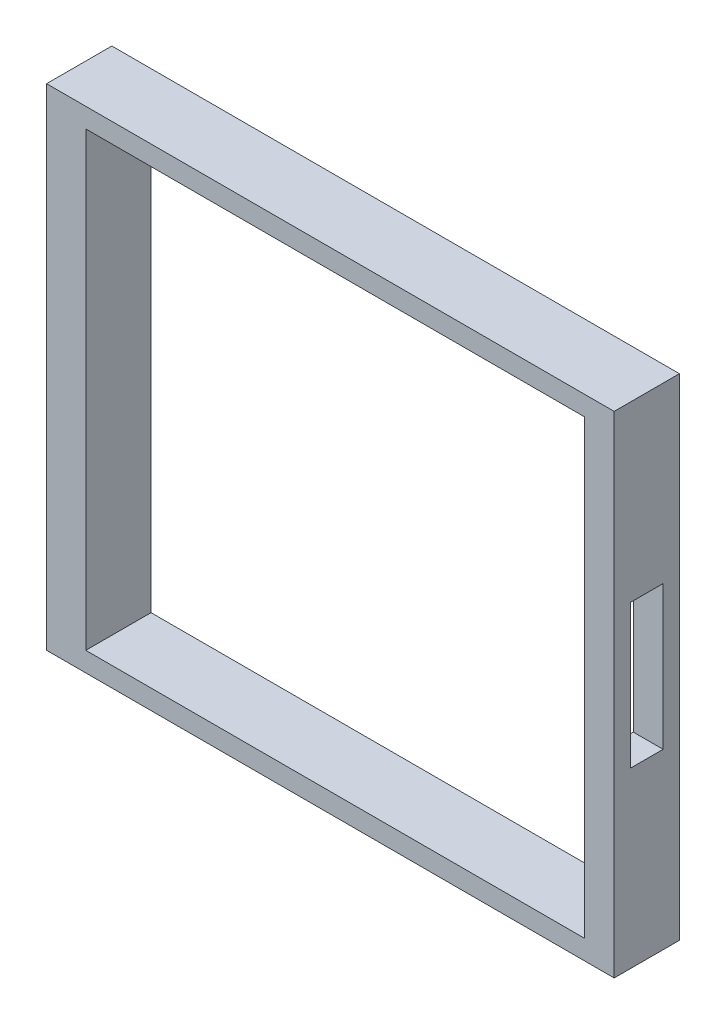
ISO-10303-21;
HEADER;
FILE_DESCRIPTION(('STEP AP214'),'2;1');
FILE_NAME('part.step','',(''),(''),'','','');
FILE_SCHEMA(('AUTOMOTIVE_DESIGN { 1 0 10303 214 1 1 1 1 }'));
ENDSEC;
DATA;
#1=APPLICATION_CONTEXT('core data for automotive mechanical design processes');
#2=APPLICATION_PROTOCOL_DEFINITION('international standard','automotive_design',2000,#1);
#3=PRODUCT_CONTEXT('',#1,'mechanical');
#4=PRODUCT('Part','Part','',(#3));
#5=PRODUCT_RELATED_PRODUCT_CATEGORY('part','',(#4));
#6=PRODUCT_DEFINITION_FORMATION('','',#4);
#7=PRODUCT_DEFINITION_CONTEXT('part definition',#1,'design');
#8=PRODUCT_DEFINITION('design','',#6,#7);
#9=PRODUCT_DEFINITION_SHAPE('','',#8);
#10=(LENGTH_UNIT() NAMED_UNIT(*) SI_UNIT(.MILLI.,.METRE.));
#11=(NAMED_UNIT(*) PLANE_ANGLE_UNIT() SI_UNIT($,.RADIAN.));
#12=(NAMED_UNIT(*) SI_UNIT($,.STERADIAN.) SOLID_ANGLE_UNIT());
#13=UNCERTAINTY_MEASURE_WITH_UNIT(LENGTH_MEASURE(1.E-05),#10,'distance_accuracy_value','');
#14=(GEOMETRIC_REPRESENTATION_CONTEXT(3) GLOBAL_UNCERTAINTY_ASSIGNED_CONTEXT((#13)) GLOBAL_UNIT_ASSIGNED_CONTEXT((#10,
#11,#12)) REPRESENTATION_CONTEXT('',''));
#15=CARTESIAN_POINT('',(0.,0.,0.));
#16=DIRECTION('',(0.,0.,1.));
#17=DIRECTION('',(1.,0.,0.));
#18=AXIS2_PLACEMENT_3D('',#15,#16,#17);
#19=CARTESIAN_POINT('',(0.,0.,10.));
#20=DIRECTION('',(0.,0.,1.));
#21=DIRECTION('',(1.,0.,0.));
#22=AXIS2_PLACEMENT_3D('',#19,#20,#21);
#23=PLANE('',#22);
#24=DIRECTION('',(0.,-1.,0.));
#25=VECTOR('',#24,1.);
#26=CARTESIAN_POINT('',(-40.5786086910142,22.956628741391,10.));
#27=LINE('',#26,#25);
#28=CARTESIAN_POINT('',(-40.5786086910142,22.956628741391,10.));
#29=VERTEX_POINT('',#28);
#30=CARTESIAN_POINT('',(-40.5786086910142,-52.243371258609,10.));
#31=VERTEX_POINT('',#30);
#32=EDGE_CURVE('E214',#29,#31,#27,.T.);
#33=ORIENTED_EDGE('',*,*,#32,.T.);
#34=DIRECTION('',(1.,0.,0.));
#35=VECTOR('',#34,1.);
#36=CARTESIAN_POINT('',(-40.5786086910142,-52.243371258609,10.));
#37=LINE('',#36,#35);
#38=CARTESIAN_POINT('',(46.3987708933674,-52.243371258609,10.));
#39=VERTEX_POINT('',#38);
#40=EDGE_CURVE('E218',#31,#39,#37,.T.);
#41=ORIENTED_EDGE('',*,*,#40,.T.);
#42=DIRECTION('',(0.,1.,0.));
#43=VECTOR('',#42,1.);
#44=CARTESIAN_POINT('',(46.3987708933674,22.956628741391,10.));
#45=LINE('',#44,#43);
#46=CARTESIAN_POINT('',(46.3987708933674,22.956628741391,10.));
#47=VERTEX_POINT('',#46);
#48=EDGE_CURVE('E222',#39,#47,#45,.T.);
#49=ORIENTED_EDGE('',*,*,#48,.T.);
#50=DIRECTION('',(-1.,0.,0.));
#51=VECTOR('',#50,1.);
#52=CARTESIAN_POINT('',(-40.5786086910142,22.956628741391,10.));
#53=LINE('',#52,#51);
#54=EDGE_CURVE('E225',#47,#29,#53,.T.);
#55=ORIENTED_EDGE('',*,*,#54,.T.);
#56=EDGE_LOOP('',(#33,#41,#49,#55));
#57=FACE_BOUND('',#56,.T.);
#58=DIRECTION('',(1.,0.,0.));
#59=VECTOR('',#58,1.);
#60=CARTESIAN_POINT('',(-34.5728365384615,-49.243371258609,10.));
#61=LINE('',#60,#59);
#62=CARTESIAN_POINT('',(-34.5728365384615,-49.243371258609,10.));
#63=VERTEX_POINT('',#62);
#64=CARTESIAN_POINT('',(41.8271634615385,-49.243371258609,10.));
#65=VERTEX_POINT('',#64);
#66=EDGE_CURVE('E174',#63,#65,#61,.T.);
#67=ORIENTED_EDGE('',*,*,#66,.F.);
#68=DIRECTION('',(0.,-1.,0.));
#69=VECTOR('',#68,1.);
#70=CARTESIAN_POINT('',(-34.5728365384615,19.956628741391,10.));
#71=LINE('',#70,#69);
#72=CARTESIAN_POINT('',(-34.5728365384615,19.956628741391,10.));
#73=VERTEX_POINT('',#72);
#74=EDGE_CURVE('E171',#73,#63,#71,.T.);
#75=ORIENTED_EDGE('',*,*,#74,.F.);
#76=DIRECTION('',(-1.,0.,0.));
#77=VECTOR('',#76,1.);
#78=CARTESIAN_POINT('',(-34.5728365384615,19.956628741391,10.));
#79=LINE('',#78,#77);
#80=CARTESIAN_POINT('',(41.8271634615385,19.956628741391,10.));
#81=VERTEX_POINT('',#80);
#82=EDGE_CURVE('E182',#81,#73,#79,.T.);
#83=ORIENTED_EDGE('',*,*,#82,.F.);
#84=DIRECTION('',(0.,1.,0.));
#85=VECTOR('',#84,1.);
#86=CARTESIAN_POINT('',(41.8271634615385,19.956628741391,10.));
#87=LINE('',#86,#85);
#88=EDGE_CURVE('E178',#65,#81,#87,.T.);
#89=ORIENTED_EDGE('',*,*,#88,.F.);
#90=EDGE_LOOP('',(#67,#75,#83,#89));
#91=FACE_BOUND('',#90,.T.);
#92=ADVANCED_FACE('F46',(#57,#91),#23,.T.);
#93=CARTESIAN_POINT('',(0.,0.,0.));
#94=DIRECTION('',(0.,0.,1.));
#95=DIRECTION('',(1.,0.,0.));
#96=AXIS2_PLACEMENT_3D('',#93,#94,#95);
#97=PLANE('',#96);
#98=DIRECTION('',(0.,-1.,0.));
#99=VECTOR('',#98,1.);
#100=CARTESIAN_POINT('',(-40.5786086910142,22.956628741391,0.));
#101=LINE('',#100,#99);
#102=CARTESIAN_POINT('',(-40.5786086910142,22.956628741391,0.));
#103=VERTEX_POINT('',#102);
#104=CARTESIAN_POINT('',(-40.5786086910142,-52.243371258609,0.));
#105=VERTEX_POINT('',#104);
#106=EDGE_CURVE('E213',#103,#105,#101,.T.);
#107=ORIENTED_EDGE('',*,*,#106,.F.);
#108=DIRECTION('',(-1.,0.,0.));
#109=VECTOR('',#108,1.);
#110=CARTESIAN_POINT('',(-40.5786086910142,22.956628741391,0.));
#111=LINE('',#110,#109);
#112=CARTESIAN_POINT('',(46.3987708933674,22.956628741391,0.));
#113=VERTEX_POINT('',#112);
#114=EDGE_CURVE('E219',#113,#103,#111,.T.);
#115=ORIENTED_EDGE('',*,*,#114,.F.);
#116=DIRECTION('',(0.,1.,0.));
#117=VECTOR('',#116,1.);
#118=CARTESIAN_POINT('',(46.3987708933674,22.956628741391,0.));
#119=LINE('',#118,#117);
#120=CARTESIAN_POINT('',(46.3987708933674,-52.243371258609,0.));
#121=VERTEX_POINT('',#120);
#122=EDGE_CURVE('E235',#121,#113,#119,.T.);
#123=ORIENTED_EDGE('',*,*,#122,.F.);
#124=DIRECTION('',(1.,0.,0.));
#125=VECTOR('',#124,1.);
#126=CARTESIAN_POINT('',(-40.5786086910142,-52.243371258609,0.));
#127=LINE('',#126,#125);
#128=EDGE_CURVE('E232',#105,#121,#127,.T.);
#129=ORIENTED_EDGE('',*,*,#128,.F.);
#130=EDGE_LOOP('',(#107,#115,#123,#129));
#131=FACE_BOUND('',#130,.T.);
#132=DIRECTION('',(0.,-1.,0.));
#133=VECTOR('',#132,1.);
#134=CARTESIAN_POINT('',(-34.5728365384615,19.956628741391,0.));
#135=LINE('',#134,#133);
#136=CARTESIAN_POINT('',(-34.5728365384615,19.956628741391,0.));
#137=VERTEX_POINT('',#136);
#138=CARTESIAN_POINT('',(-34.5728365384615,-49.243371258609,0.));
#139=VERTEX_POINT('',#138);
#140=EDGE_CURVE('E166',#137,#139,#135,.T.);
#141=ORIENTED_EDGE('',*,*,#140,.T.);
#142=DIRECTION('',(1.,0.,0.));
#143=VECTOR('',#142,1.);
#144=CARTESIAN_POINT('',(-34.5728365384615,-49.243371258609,0.));
#145=LINE('',#144,#143);
#146=CARTESIAN_POINT('',(41.8271634615385,-49.243371258609,0.));
#147=VERTEX_POINT('',#146);
#148=EDGE_CURVE('E189',#139,#147,#145,.T.);
#149=ORIENTED_EDGE('',*,*,#148,.T.);
#150=DIRECTION('',(0.,1.,0.));
#151=VECTOR('',#150,1.);
#152=CARTESIAN_POINT('',(41.8271634615385,19.956628741391,0.));
#153=LINE('',#152,#151);
#154=CARTESIAN_POINT('',(41.8271634615385,19.956628741391,0.));
#155=VERTEX_POINT('',#154);
#156=EDGE_CURVE('E193',#147,#155,#153,.T.);
#157=ORIENTED_EDGE('',*,*,#156,.T.);
#158=DIRECTION('',(-1.,0.,0.));
#159=VECTOR('',#158,1.);
#160=CARTESIAN_POINT('',(-34.5728365384615,19.956628741391,0.));
#161=LINE('',#160,#159);
#162=EDGE_CURVE('E175',#155,#137,#161,.T.);
#163=ORIENTED_EDGE('',*,*,#162,.T.);
#164=EDGE_LOOP('',(#141,#149,#157,#163));
#165=FACE_BOUND('',#164,.T.);
#166=ADVANCED_FACE('F283',(#131,#165),#97,.F.);
#167=CARTESIAN_POINT('',(-40.5786086910142,22.956628741391,10.));
#168=DIRECTION('',(1.,0.,0.));
#169=DIRECTION('',(0.,1.,0.));
#170=AXIS2_PLACEMENT_3D('',#167,#168,#169);
#171=PLANE('',#170);
#172=ORIENTED_EDGE('',*,*,#106,.T.);
#173=DIRECTION('',(0.,0.,-1.));
#174=VECTOR('',#173,1.);
#175=CARTESIAN_POINT('',(-40.5786086910142,-52.243371258609,10.));
#176=LINE('',#175,#174);
#177=EDGE_CURVE('E251',#31,#105,#176,.T.);
#178=ORIENTED_EDGE('',*,*,#177,.F.);
#179=ORIENTED_EDGE('',*,*,#32,.F.);
#180=DIRECTION('',(0.,0.,-1.));
#181=VECTOR('',#180,1.);
#182=CARTESIAN_POINT('',(-40.5786086910142,22.956628741391,10.));
#183=LINE('',#182,#181);
#184=EDGE_CURVE('E228',#29,#103,#183,.T.);
#185=ORIENTED_EDGE('',*,*,#184,.T.);
#186=EDGE_LOOP('',(#172,#178,#179,#185));
#187=FACE_BOUND('',#186,.T.);
#188=ADVANCED_FACE('F48',(#187),#171,.F.);
#189=CARTESIAN_POINT('',(-40.5786086910142,-52.243371258609,10.));
#190=DIRECTION('',(0.,1.,0.));
#191=DIRECTION('',(0.,0.,1.));
#192=AXIS2_PLACEMENT_3D('',#189,#190,#191);
#193=PLANE('',#192);
#194=ORIENTED_EDGE('',*,*,#128,.T.);
#195=DIRECTION('',(0.,0.,-1.));
#196=VECTOR('',#195,1.);
#197=CARTESIAN_POINT('',(46.3987708933674,-52.243371258609,10.));
#198=LINE('',#197,#196);
#199=EDGE_CURVE('E247',#39,#121,#198,.T.);
#200=ORIENTED_EDGE('',*,*,#199,.F.);
#201=ORIENTED_EDGE('',*,*,#40,.F.);
#202=ORIENTED_EDGE('',*,*,#177,.T.);
#203=EDGE_LOOP('',(#194,#200,#201,#202));
#204=FACE_BOUND('',#203,.T.);
#205=ADVANCED_FACE('F301',(#204),#193,.F.);
#206=CARTESIAN_POINT('',(46.3987708933674,22.956628741391,10.));
#207=DIRECTION('',(-1.,0.,0.));
#208=DIRECTION('',(0.,0.,1.));
#209=AXIS2_PLACEMENT_3D('',#206,#207,#208);
#210=PLANE('',#209);
#211=DIRECTION('',(0.,0.,-1.));
#212=VECTOR('',#211,1.);
#213=CARTESIAN_POINT('',(46.3987708933674,-25.643371258609,2.5));
#214=LINE('',#213,#212);
#215=CARTESIAN_POINT('',(46.3987708933674,-25.643371258609,7.5));
#216=VERTEX_POINT('',#215);
#217=CARTESIAN_POINT('',(46.3987708933674,-25.643371258609,2.5));
#218=VERTEX_POINT('',#217);
#219=EDGE_CURVE('E148',#216,#218,#214,.T.);
#220=ORIENTED_EDGE('',*,*,#219,.F.);
#221=DIRECTION('',(0.,-1.,0.));
#222=VECTOR('',#221,1.);
#223=CARTESIAN_POINT('',(46.3987708933674,-25.643371258609,7.5));
#224=LINE('',#223,#222);
#225=CARTESIAN_POINT('',(46.3987708933674,-3.64337125860899,7.50000000000001));
#226=VERTEX_POINT('',#225);
#227=EDGE_CURVE('E62',#226,#216,#224,.T.);
#228=ORIENTED_EDGE('',*,*,#227,.F.);
#229=DIRECTION('',(0.,0.,1.));
#230=VECTOR('',#229,1.);
#231=CARTESIAN_POINT('',(46.3987708933674,-3.64337125860899,2.50000000000001));
#232=LINE('',#231,#230);
#233=CARTESIAN_POINT('',(46.3987708933674,-3.64337125860899,2.50000000000001));
#234=VERTEX_POINT('',#233);
#235=EDGE_CURVE('E156',#234,#226,#232,.T.);
#236=ORIENTED_EDGE('',*,*,#235,.F.);
#237=DIRECTION('',(0.,1.,0.));
#238=VECTOR('',#237,1.);
#239=CARTESIAN_POINT('',(46.3987708933674,-25.643371258609,2.5));
#240=LINE('',#239,#238);
#241=EDGE_CURVE('E138',#218,#234,#240,.T.);
#242=ORIENTED_EDGE('',*,*,#241,.F.);
#243=EDGE_LOOP('',(#220,#228,#236,#242));
#244=FACE_BOUND('',#243,.T.);
#245=ORIENTED_EDGE('',*,*,#122,.T.);
#246=DIRECTION('',(0.,0.,-1.));
#247=VECTOR('',#246,1.);
#248=CARTESIAN_POINT('',(46.3987708933674,22.956628741391,10.));
#249=LINE('',#248,#247);
#250=EDGE_CURVE('E243',#47,#113,#249,.T.);
#251=ORIENTED_EDGE('',*,*,#250,.F.);
#252=ORIENTED_EDGE('',*,*,#48,.F.);
#253=ORIENTED_EDGE('',*,*,#199,.T.);
#254=EDGE_LOOP('',(#245,#251,#252,#253));
#255=FACE_BOUND('',#254,.T.);
#256=ADVANCED_FACE('F153',(#244,#255),#210,.F.);
#257=CARTESIAN_POINT('',(-40.5786086910142,22.956628741391,10.));
#258=DIRECTION('',(0.,-1.,0.));
#259=DIRECTION('',(0.,0.,-1.));
#260=AXIS2_PLACEMENT_3D('',#257,#258,#259);
#261=PLANE('',#260);
#262=ORIENTED_EDGE('',*,*,#114,.T.);
#263=ORIENTED_EDGE('',*,*,#184,.F.);
#264=ORIENTED_EDGE('',*,*,#54,.F.);
#265=ORIENTED_EDGE('',*,*,#250,.T.);
#266=EDGE_LOOP('',(#262,#263,#264,#265));
#267=FACE_BOUND('',#266,.T.);
#268=ADVANCED_FACE('F296',(#267),#261,.F.);
#269=CARTESIAN_POINT('',(-34.5728365384615,19.956628741391,10.));
#270=DIRECTION('',(1.,0.,0.));
#271=DIRECTION('',(0.,1.,0.));
#272=AXIS2_PLACEMENT_3D('',#269,#270,#271);
#273=PLANE('',#272);
#274=ORIENTED_EDGE('',*,*,#140,.F.);
#275=DIRECTION('',(0.,0.,-1.));
#276=VECTOR('',#275,1.);
#277=CARTESIAN_POINT('',(-34.5728365384615,19.956628741391,10.));
#278=LINE('',#277,#276);
#279=EDGE_CURVE('E185',#73,#137,#278,.T.);
#280=ORIENTED_EDGE('',*,*,#279,.F.);
#281=ORIENTED_EDGE('',*,*,#74,.T.);
#282=DIRECTION('',(0.,0.,-1.));
#283=VECTOR('',#282,1.);
#284=CARTESIAN_POINT('',(-34.5728365384615,-49.243371258609,10.));
#285=LINE('',#284,#283);
#286=EDGE_CURVE('E209',#63,#139,#285,.T.);
#287=ORIENTED_EDGE('',*,*,#286,.T.);
#288=EDGE_LOOP('',(#274,#280,#281,#287));
#289=FACE_BOUND('',#288,.T.);
#290=ADVANCED_FACE('F293',(#289),#273,.T.);
#291=CARTESIAN_POINT('',(-34.5728365384615,-49.243371258609,10.));
#292=DIRECTION('',(0.,1.,0.));
#293=DIRECTION('',(-1.,0.,0.));
#294=AXIS2_PLACEMENT_3D('',#291,#292,#293);
#295=PLANE('',#294);
#296=ORIENTED_EDGE('',*,*,#148,.F.);
#297=ORIENTED_EDGE('',*,*,#286,.F.);
#298=ORIENTED_EDGE('',*,*,#66,.T.);
#299=DIRECTION('',(0.,0.,-1.));
#300=VECTOR('',#299,1.);
#301=CARTESIAN_POINT('',(41.8271634615385,-49.243371258609,10.));
#302=LINE('',#301,#300);
#303=EDGE_CURVE('E206',#65,#147,#302,.T.);
#304=ORIENTED_EDGE('',*,*,#303,.T.);
#305=EDGE_LOOP('',(#296,#297,#298,#304));
#306=FACE_BOUND('',#305,.T.);
#307=ADVANCED_FACE('F328',(#306),#295,.T.);
#308=CARTESIAN_POINT('',(41.8271634615385,19.956628741391,10.));
#309=DIRECTION('',(-1.,0.,0.));
#310=DIRECTION('',(0.,-1.,0.));
#311=AXIS2_PLACEMENT_3D('',#308,#309,#310);
#312=PLANE('',#311);
#313=DIRECTION('',(0.,1.,0.));
#314=VECTOR('',#313,1.);
#315=CARTESIAN_POINT('',(41.8271634615385,19.956628741391,7.50000000000001));
#316=LINE('',#315,#314);
#317=CARTESIAN_POINT('',(41.8271634615385,-25.643371258609,7.5));
#318=VERTEX_POINT('',#317);
#319=CARTESIAN_POINT('',(41.8271634615385,-3.64337125860899,7.50000000000001));
#320=VERTEX_POINT('',#319);
#321=EDGE_CURVE('E11',#318,#320,#316,.T.);
#322=ORIENTED_EDGE('',*,*,#321,.F.);
#323=DIRECTION('',(0.,0.,1.));
#324=VECTOR('',#323,1.);
#325=CARTESIAN_POINT('',(41.8271634615385,-25.643371258609,10.));
#326=LINE('',#325,#324);
#327=CARTESIAN_POINT('',(41.8271634615385,-25.643371258609,2.5));
#328=VERTEX_POINT('',#327);
#329=EDGE_CURVE('E255',#328,#318,#326,.T.);
#330=ORIENTED_EDGE('',*,*,#329,.F.);
#331=DIRECTION('',(0.,-1.,0.));
#332=VECTOR('',#331,1.);
#333=CARTESIAN_POINT('',(41.8271634615385,19.956628741391,2.50000000000001));
#334=LINE('',#333,#332);
#335=CARTESIAN_POINT('',(41.8271634615385,-3.64337125860899,2.50000000000001));
#336=VERTEX_POINT('',#335);
#337=EDGE_CURVE('E141',#336,#328,#334,.T.);
#338=ORIENTED_EDGE('',*,*,#337,.F.);
#339=DIRECTION('',(0.,0.,-1.));
#340=VECTOR('',#339,1.);
#341=CARTESIAN_POINT('',(41.8271634615385,-3.64337125860899,10.));
#342=LINE('',#341,#340);
#343=EDGE_CURVE('E55',#320,#336,#342,.T.);
#344=ORIENTED_EDGE('',*,*,#343,.F.);
#345=EDGE_LOOP('',(#322,#330,#338,#344));
#346=FACE_BOUND('',#345,.T.);
#347=ORIENTED_EDGE('',*,*,#156,.F.);
#348=ORIENTED_EDGE('',*,*,#303,.F.);
#349=ORIENTED_EDGE('',*,*,#88,.T.);
#350=DIRECTION('',(0.,0.,-1.));
#351=VECTOR('',#350,1.);
#352=CARTESIAN_POINT('',(41.8271634615385,19.956628741391,10.));
#353=LINE('',#352,#351);
#354=EDGE_CURVE('E203',#81,#155,#353,.T.);
#355=ORIENTED_EDGE('',*,*,#354,.T.);
#356=EDGE_LOOP('',(#347,#348,#349,#355));
#357=FACE_BOUND('',#356,.T.);
#358=ADVANCED_FACE('F266',(#346,#357),#312,.T.);
#359=CARTESIAN_POINT('',(-34.5728365384615,19.956628741391,10.));
#360=DIRECTION('',(0.,-1.,0.));
#361=DIRECTION('',(0.,0.,-1.));
#362=AXIS2_PLACEMENT_3D('',#359,#360,#361);
#363=PLANE('',#362);
#364=ORIENTED_EDGE('',*,*,#162,.F.);
#365=ORIENTED_EDGE('',*,*,#354,.F.);
#366=ORIENTED_EDGE('',*,*,#82,.T.);
#367=ORIENTED_EDGE('',*,*,#279,.T.);
#368=EDGE_LOOP('',(#364,#365,#366,#367));
#369=FACE_BOUND('',#368,.T.);
#370=ADVANCED_FACE('F271',(#369),#363,.T.);
#371=CARTESIAN_POINT('',(41.3987708933674,-25.643371258609,7.5));
#372=DIRECTION('',(0.,0.,1.));
#373=DIRECTION('',(0.,-1.,0.));
#374=AXIS2_PLACEMENT_3D('',#371,#372,#373);
#375=PLANE('',#374);
#376=ORIENTED_EDGE('',*,*,#321,.T.);
#377=DIRECTION('',(1.,0.,0.));
#378=VECTOR('',#377,1.);
#379=CARTESIAN_POINT('',(41.3987708933674,-3.64337125860899,7.50000000000001));
#380=LINE('',#379,#378);
#381=EDGE_CURVE('E163',#320,#226,#380,.T.);
#382=ORIENTED_EDGE('',*,*,#381,.T.);
#383=ORIENTED_EDGE('',*,*,#227,.T.);
#384=DIRECTION('',(1.,0.,0.));
#385=VECTOR('',#384,1.);
#386=CARTESIAN_POINT('',(41.3987708933674,-25.643371258609,7.5));
#387=LINE('',#386,#385);
#388=EDGE_CURVE('E145',#318,#216,#387,.T.);
#389=ORIENTED_EDGE('',*,*,#388,.F.);
#390=EDGE_LOOP('',(#376,#382,#383,#389));
#391=FACE_BOUND('',#390,.T.);
#392=ADVANCED_FACE('F268',(#391),#375,.F.);
#393=CARTESIAN_POINT('',(41.3987708933674,-3.64337125860899,2.50000000000001));
#394=DIRECTION('',(0.,1.,0.));
#395=DIRECTION('',(0.,0.,1.));
#396=AXIS2_PLACEMENT_3D('',#393,#394,#395);
#397=PLANE('',#396);
#398=ORIENTED_EDGE('',*,*,#343,.T.);
#399=DIRECTION('',(1.,0.,0.));
#400=VECTOR('',#399,1.);
#401=CARTESIAN_POINT('',(41.3987708933674,-3.64337125860899,2.50000000000001));
#402=LINE('',#401,#400);
#403=EDGE_CURVE('E144',#336,#234,#402,.T.);
#404=ORIENTED_EDGE('',*,*,#403,.T.);
#405=ORIENTED_EDGE('',*,*,#235,.T.);
#406=ORIENTED_EDGE('',*,*,#381,.F.);
#407=EDGE_LOOP('',(#398,#404,#405,#406));
#408=FACE_BOUND('',#407,.T.);
#409=ADVANCED_FACE('F263',(#408),#397,.F.);
#410=CARTESIAN_POINT('',(41.3987708933674,-25.643371258609,2.5));
#411=DIRECTION('',(0.,0.,-1.));
#412=DIRECTION('',(0.,1.,0.));
#413=AXIS2_PLACEMENT_3D('',#410,#411,#412);
#414=PLANE('',#413);
#415=ORIENTED_EDGE('',*,*,#337,.T.);
#416=DIRECTION('',(1.,0.,0.));
#417=VECTOR('',#416,1.);
#418=CARTESIAN_POINT('',(41.3987708933674,-25.643371258609,2.5));
#419=LINE('',#418,#417);
#420=EDGE_CURVE('E70',#328,#218,#419,.T.);
#421=ORIENTED_EDGE('',*,*,#420,.T.);
#422=ORIENTED_EDGE('',*,*,#241,.T.);
#423=ORIENTED_EDGE('',*,*,#403,.F.);
#424=EDGE_LOOP('',(#415,#421,#422,#423));
#425=FACE_BOUND('',#424,.T.);
#426=ADVANCED_FACE('F135',(#425),#414,.F.);
#427=CARTESIAN_POINT('',(41.3987708933674,-25.643371258609,2.5));
#428=DIRECTION('',(0.,-1.,0.));
#429=DIRECTION('',(0.,0.,-1.));
#430=AXIS2_PLACEMENT_3D('',#427,#428,#429);
#431=PLANE('',#430);
#432=ORIENTED_EDGE('',*,*,#329,.T.);
#433=ORIENTED_EDGE('',*,*,#388,.T.);
#434=ORIENTED_EDGE('',*,*,#219,.T.);
#435=ORIENTED_EDGE('',*,*,#420,.F.);
#436=EDGE_LOOP('',(#432,#433,#434,#435));
#437=FACE_BOUND('',#436,.T.);
#438=ADVANCED_FACE('F149',(#437),#431,.F.);
#439=CLOSED_SHELL('',(#92,#166,#188,#205,#256,#268,#290,#307,#358,#370,#392,#409,#426,#438));
#440=MANIFOLD_SOLID_BREP('B2',#439);
#441=ADVANCED_BREP_SHAPE_REPRESENTATION('',(#18,#440),#14);
#442=SHAPE_DEFINITION_REPRESENTATION(#9,#441);
ENDSEC;
END-ISO-10303-21;
